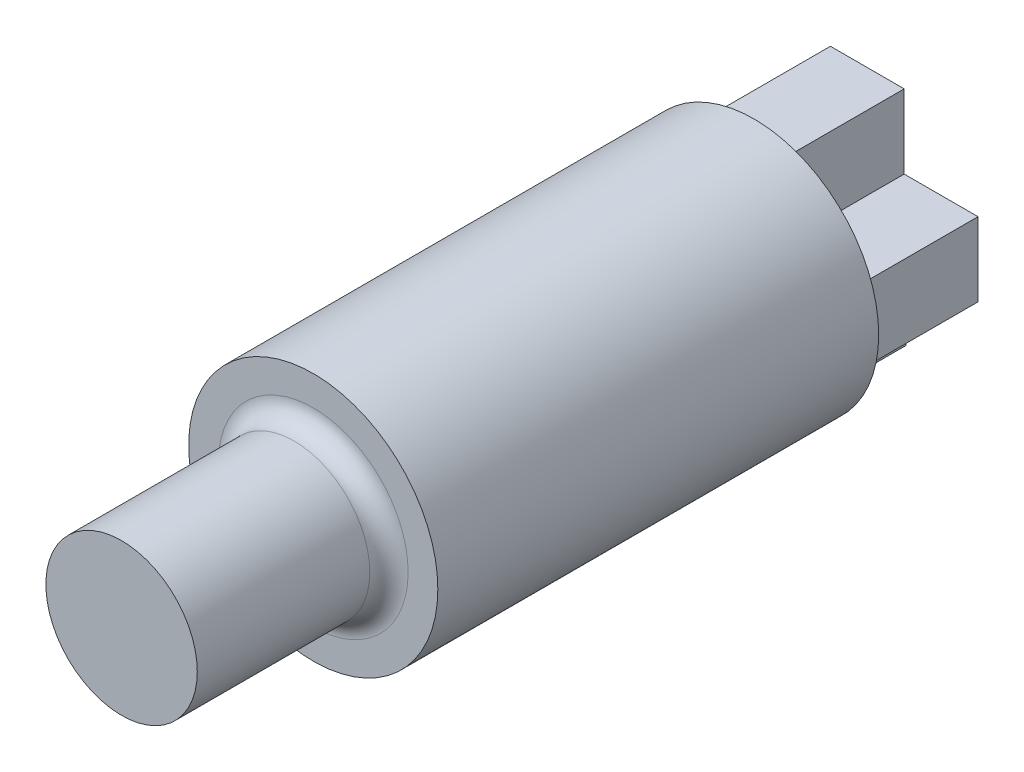
ISO-10303-21;
HEADER;
FILE_DESCRIPTION(('STEP AP214'),'2;1');
FILE_NAME('part.step','',(''),(''),'','','');
FILE_SCHEMA(('AUTOMOTIVE_DESIGN { 1 0 10303 214 1 1 1 1 }'));
ENDSEC;
DATA;
#1=APPLICATION_CONTEXT('core data for automotive mechanical design processes');
#2=APPLICATION_PROTOCOL_DEFINITION('international standard','automotive_design',2000,#1);
#3=PRODUCT_CONTEXT('',#1,'mechanical');
#4=PRODUCT('Part','Part','',(#3));
#5=PRODUCT_RELATED_PRODUCT_CATEGORY('part','',(#4));
#6=PRODUCT_DEFINITION_FORMATION('','',#4);
#7=PRODUCT_DEFINITION_CONTEXT('part definition',#1,'design');
#8=PRODUCT_DEFINITION('design','',#6,#7);
#9=PRODUCT_DEFINITION_SHAPE('','',#8);
#10=(LENGTH_UNIT() NAMED_UNIT(*) SI_UNIT(.MILLI.,.METRE.));
#11=(NAMED_UNIT(*) PLANE_ANGLE_UNIT() SI_UNIT($,.RADIAN.));
#12=(NAMED_UNIT(*) SI_UNIT($,.STERADIAN.) SOLID_ANGLE_UNIT());
#13=UNCERTAINTY_MEASURE_WITH_UNIT(LENGTH_MEASURE(1.E-05),#10,'distance_accuracy_value','');
#14=(GEOMETRIC_REPRESENTATION_CONTEXT(3) GLOBAL_UNCERTAINTY_ASSIGNED_CONTEXT((#13)) GLOBAL_UNIT_ASSIGNED_CONTEXT((#10,
#11,#12)) REPRESENTATION_CONTEXT('',''));
#15=CARTESIAN_POINT('',(0.,0.,0.));
#16=DIRECTION('',(0.,0.,1.));
#17=DIRECTION('',(1.,0.,0.));
#18=AXIS2_PLACEMENT_3D('',#15,#16,#17);
#19=CARTESIAN_POINT('',(0.,0.,0.));
#20=DIRECTION('',(0.,0.,1.));
#21=DIRECTION('',(1.,0.,0.));
#22=AXIS2_PLACEMENT_3D('',#19,#20,#21);
#23=PLANE('',#22);
#24=CARTESIAN_POINT('',(0.,0.,0.));
#25=DIRECTION('',(0.,0.,1.));
#26=DIRECTION('',(1.,0.,0.));
#27=AXIS2_PLACEMENT_3D('',#24,#25,#26);
#28=CIRCLE('',#27,6.5);
#29=CARTESIAN_POINT('',(6.5,0.,0.));
#30=VERTEX_POINT('',#29);
#31=EDGE_CURVE('E163',#30,#30,#28,.T.);
#32=ORIENTED_EDGE('',*,*,#31,.F.);
#33=EDGE_LOOP('',(#32));
#34=FACE_BOUND('',#33,.T.);
#35=DIRECTION('',(0.,-1.,0.));
#36=VECTOR('',#35,1.);
#37=CARTESIAN_POINT('',(1.8306957755296,1.925,0.));
#38=LINE('',#37,#36);
#39=CARTESIAN_POINT('',(1.8306957755296,5.775,0.));
#40=VERTEX_POINT('',#39);
#41=CARTESIAN_POINT('',(1.8306957755296,1.925,0.));
#42=VERTEX_POINT('',#41);
#43=EDGE_CURVE('E61',#40,#42,#38,.T.);
#44=ORIENTED_EDGE('',*,*,#43,.F.);
#45=DIRECTION('',(1.,0.,0.));
#46=VECTOR('',#45,1.);
#47=CARTESIAN_POINT('',(1.8306957755296,5.775,0.));
#48=LINE('',#47,#46);
#49=CARTESIAN_POINT('',(-2.0193042244704,5.775,0.));
#50=VERTEX_POINT('',#49);
#51=EDGE_CURVE('E65',#50,#40,#48,.T.);
#52=ORIENTED_EDGE('',*,*,#51,.F.);
#53=DIRECTION('',(0.,1.,0.));
#54=VECTOR('',#53,1.);
#55=CARTESIAN_POINT('',(-2.0193042244704,5.775,0.));
#56=LINE('',#55,#54);
#57=CARTESIAN_POINT('',(-2.0193042244704,1.925,0.));
#58=VERTEX_POINT('',#57);
#59=EDGE_CURVE('E367',#58,#50,#56,.T.);
#60=ORIENTED_EDGE('',*,*,#59,.F.);
#61=DIRECTION('',(1.,0.,0.));
#62=VECTOR('',#61,1.);
#63=CARTESIAN_POINT('',(-2.0193042244704,1.925,0.));
#64=LINE('',#63,#62);
#65=CARTESIAN_POINT('',(-5.775,1.925,0.));
#66=VERTEX_POINT('',#65);
#67=EDGE_CURVE('E444',#66,#58,#64,.T.);
#68=ORIENTED_EDGE('',*,*,#67,.F.);
#69=DIRECTION('',(0.,1.,0.));
#70=VECTOR('',#69,1.);
#71=CARTESIAN_POINT('',(-5.775,1.925,0.));
#72=LINE('',#71,#70);
#73=CARTESIAN_POINT('',(-5.775,-1.925,0.));
#74=VERTEX_POINT('',#73);
#75=EDGE_CURVE('E440',#74,#66,#72,.T.);
#76=ORIENTED_EDGE('',*,*,#75,.F.);
#77=DIRECTION('',(-1.,0.,0.));
#78=VECTOR('',#77,1.);
#79=CARTESIAN_POINT('',(-5.775,-1.925,0.));
#80=LINE('',#79,#78);
#81=CARTESIAN_POINT('',(-1.925,-1.925,0.));
#82=VERTEX_POINT('',#81);
#83=EDGE_CURVE('E436',#82,#74,#80,.T.);
#84=ORIENTED_EDGE('',*,*,#83,.F.);
#85=DIRECTION('',(0.,1.,0.));
#86=VECTOR('',#85,1.);
#87=CARTESIAN_POINT('',(-1.925,-1.925,0.));
#88=LINE('',#87,#86);
#89=CARTESIAN_POINT('',(-1.925,-5.775,0.));
#90=VERTEX_POINT('',#89);
#91=EDGE_CURVE('E432',#90,#82,#88,.T.);
#92=ORIENTED_EDGE('',*,*,#91,.F.);
#93=DIRECTION('',(-1.,0.,0.));
#94=VECTOR('',#93,1.);
#95=CARTESIAN_POINT('',(-1.925,-5.775,0.));
#96=LINE('',#95,#94);
#97=CARTESIAN_POINT('',(1.925,-5.775,0.));
#98=VERTEX_POINT('',#97);
#99=EDGE_CURVE('E428',#98,#90,#96,.T.);
#100=ORIENTED_EDGE('',*,*,#99,.F.);
#101=DIRECTION('',(0.,-1.,0.));
#102=VECTOR('',#101,1.);
#103=CARTESIAN_POINT('',(1.925,-5.775,0.));
#104=LINE('',#103,#102);
#105=CARTESIAN_POINT('',(1.925,-1.925,0.));
#106=VERTEX_POINT('',#105);
#107=EDGE_CURVE('E420',#106,#98,#104,.T.);
#108=ORIENTED_EDGE('',*,*,#107,.F.);
#109=DIRECTION('',(-1.,0.,0.));
#110=VECTOR('',#109,1.);
#111=CARTESIAN_POINT('',(1.925,-1.925,0.));
#112=LINE('',#111,#110);
#113=CARTESIAN_POINT('',(5.6806957755296,-1.925,0.));
#114=VERTEX_POINT('',#113);
#115=EDGE_CURVE('E411',#114,#106,#112,.T.);
#116=ORIENTED_EDGE('',*,*,#115,.F.);
#117=DIRECTION('',(0.,-1.,0.));
#118=VECTOR('',#117,1.);
#119=CARTESIAN_POINT('',(5.6806957755296,-1.925,0.));
#120=LINE('',#119,#118);
#121=CARTESIAN_POINT('',(5.6806957755296,1.925,0.));
#122=VERTEX_POINT('',#121);
#123=EDGE_CURVE('E414',#122,#114,#120,.T.);
#124=ORIENTED_EDGE('',*,*,#123,.F.);
#125=DIRECTION('',(1.,0.,0.));
#126=VECTOR('',#125,1.);
#127=CARTESIAN_POINT('',(5.6806957755296,1.925,0.));
#128=LINE('',#127,#126);
#129=EDGE_CURVE('E416',#42,#122,#128,.T.);
#130=ORIENTED_EDGE('',*,*,#129,.F.);
#131=EDGE_LOOP('',(#44,#52,#60,#68,#76,#84,#92,#100,#108,#116,#124,#130));
#132=FACE_BOUND('',#131,.T.);
#133=ADVANCED_FACE('F45',(#34,#132),#23,.F.);
#134=CARTESIAN_POINT('',(0.,0.,23.));
#135=DIRECTION('',(0.,0.,-1.));
#136=DIRECTION('',(-1.,0.,0.));
#137=AXIS2_PLACEMENT_3D('',#134,#135,#136);
#138=CYLINDRICAL_SURFACE('',#137,6.5);
#139=CARTESIAN_POINT('',(0.,0.,23.));
#140=DIRECTION('',(0.,0.,1.));
#141=DIRECTION('',(1.,0.,0.));
#142=AXIS2_PLACEMENT_3D('',#139,#140,#141);
#143=CIRCLE('',#142,6.5);
#144=CARTESIAN_POINT('',(6.5,0.,23.));
#145=VERTEX_POINT('',#144);
#146=EDGE_CURVE('E169',#145,#145,#143,.T.);
#147=ORIENTED_EDGE('',*,*,#146,.F.);
#148=EDGE_LOOP('',(#147));
#149=FACE_BOUND('',#148,.T.);
#150=ORIENTED_EDGE('',*,*,#31,.T.);
#151=EDGE_LOOP('',(#150));
#152=FACE_BOUND('',#151,.T.);
#153=ADVANCED_FACE('F195',(#149,#152),#138,.T.);
#154=CARTESIAN_POINT('',(0.,0.,23.));
#155=DIRECTION('',(0.,0.,1.));
#156=DIRECTION('',(1.,0.,0.));
#157=AXIS2_PLACEMENT_3D('',#154,#155,#156);
#158=PLANE('',#157);
#159=CARTESIAN_POINT('',(0.,0.,23.));
#160=DIRECTION('',(0.,0.,1.));
#161=DIRECTION('',(1.,0.,0.));
#162=AXIS2_PLACEMENT_3D('',#159,#160,#161);
#163=CIRCLE('',#162,4.95);
#164=CARTESIAN_POINT('',(4.95,0.,23.));
#165=VERTEX_POINT('',#164);
#166=EDGE_CURVE('E11',#165,#165,#163,.F.);
#167=ORIENTED_EDGE('',*,*,#166,.T.);
#168=EDGE_LOOP('',(#167));
#169=FACE_BOUND('',#168,.T.);
#170=ORIENTED_EDGE('',*,*,#146,.T.);
#171=EDGE_LOOP('',(#170));
#172=FACE_BOUND('',#171,.T.);
#173=ADVANCED_FACE('F201',(#169,#172),#158,.T.);
#174=CARTESIAN_POINT('',(0.,0.,33.));
#175=DIRECTION('',(0.,0.,-1.));
#176=DIRECTION('',(-1.,0.,0.));
#177=AXIS2_PLACEMENT_3D('',#174,#175,#176);
#178=CYLINDRICAL_SURFACE('',#177,3.95);
#179=CARTESIAN_POINT('',(0.,0.,24.));
#180=DIRECTION('',(0.,0.,1.));
#181=DIRECTION('',(1.,0.,0.));
#182=AXIS2_PLACEMENT_3D('',#179,#180,#181);
#183=CIRCLE('',#182,3.95);
#184=CARTESIAN_POINT('',(3.95,0.,24.));
#185=VERTEX_POINT('',#184);
#186=EDGE_CURVE('E54',#185,#185,#183,.T.);
#187=ORIENTED_EDGE('',*,*,#186,.T.);
#188=EDGE_LOOP('',(#187));
#189=FACE_BOUND('',#188,.T.);
#190=CARTESIAN_POINT('',(0.,0.,33.));
#191=DIRECTION('',(0.,0.,1.));
#192=DIRECTION('',(1.,0.,0.));
#193=AXIS2_PLACEMENT_3D('',#190,#191,#192);
#194=CIRCLE('',#193,3.95);
#195=CARTESIAN_POINT('',(3.95,0.,33.));
#196=VERTEX_POINT('',#195);
#197=EDGE_CURVE('E158',#196,#196,#194,.T.);
#198=ORIENTED_EDGE('',*,*,#197,.F.);
#199=EDGE_LOOP('',(#198));
#200=FACE_BOUND('',#199,.T.);
#201=ADVANCED_FACE('F179',(#189,#200),#178,.T.);
#202=CARTESIAN_POINT('',(0.,0.,33.));
#203=DIRECTION('',(0.,0.,1.));
#204=DIRECTION('',(1.,0.,0.));
#205=AXIS2_PLACEMENT_3D('',#202,#203,#204);
#206=PLANE('',#205);
#207=ORIENTED_EDGE('',*,*,#197,.T.);
#208=EDGE_LOOP('',(#207));
#209=FACE_BOUND('',#208,.T.);
#210=ADVANCED_FACE('F183',(#209),#206,.T.);
#211=CARTESIAN_POINT('',(0.,0.,24.));
#212=DIRECTION('',(0.,0.,1.));
#213=DIRECTION('',(1.,0.,0.));
#214=AXIS2_PLACEMENT_3D('',#211,#212,#213);
#215=TOROIDAL_SURFACE('',#214,4.95,1.);
#216=ORIENTED_EDGE('',*,*,#166,.F.);
#217=EDGE_LOOP('',(#216));
#218=FACE_BOUND('',#217,.T.);
#219=ORIENTED_EDGE('',*,*,#186,.F.);
#220=EDGE_LOOP('',(#219));
#221=FACE_BOUND('',#220,.T.);
#222=ADVANCED_FACE('F47',(#218,#221),#215,.F.);
#223=CARTESIAN_POINT('',(1.8306957755296,1.925,-6.));
#224=DIRECTION('',(-1.,0.,0.));
#225=DIRECTION('',(0.,0.,1.));
#226=AXIS2_PLACEMENT_3D('',#223,#224,#225);
#227=PLANE('',#226);
#228=ORIENTED_EDGE('',*,*,#43,.T.);
#229=DIRECTION('',(0.,0.,1.));
#230=VECTOR('',#229,1.);
#231=CARTESIAN_POINT('',(1.8306957755296,1.925,-6.));
#232=LINE('',#231,#230);
#233=CARTESIAN_POINT('',(1.8306957755296,1.925,-6.));
#234=VERTEX_POINT('',#233);
#235=EDGE_CURVE('E138',#234,#42,#232,.T.);
#236=ORIENTED_EDGE('',*,*,#235,.F.);
#237=DIRECTION('',(0.,-1.,0.));
#238=VECTOR('',#237,1.);
#239=CARTESIAN_POINT('',(1.8306957755296,1.925,-6.));
#240=LINE('',#239,#238);
#241=CARTESIAN_POINT('',(1.8306957755296,5.775,-6.));
#242=VERTEX_POINT('',#241);
#243=EDGE_CURVE('E145',#242,#234,#240,.T.);
#244=ORIENTED_EDGE('',*,*,#243,.F.);
#245=DIRECTION('',(0.,0.,1.));
#246=VECTOR('',#245,1.);
#247=CARTESIAN_POINT('',(1.8306957755296,5.775,-6.));
#248=LINE('',#247,#246);
#249=EDGE_CURVE('E363',#242,#40,#248,.T.);
#250=ORIENTED_EDGE('',*,*,#249,.T.);
#251=EDGE_LOOP('',(#228,#236,#244,#250));
#252=FACE_BOUND('',#251,.T.);
#253=ADVANCED_FACE('F156',(#252),#227,.F.);
#254=CARTESIAN_POINT('',(5.6806957755296,1.925,-6.));
#255=DIRECTION('',(0.,-1.,0.));
#256=DIRECTION('',(1.,0.,0.));
#257=AXIS2_PLACEMENT_3D('',#254,#255,#256);
#258=PLANE('',#257);
#259=ORIENTED_EDGE('',*,*,#129,.T.);
#260=DIRECTION('',(0.,0.,1.));
#261=VECTOR('',#260,1.);
#262=CARTESIAN_POINT('',(5.6806957755296,1.925,-6.));
#263=LINE('',#262,#261);
#264=CARTESIAN_POINT('',(5.6806957755296,1.925,-6.));
#265=VERTEX_POINT('',#264);
#266=EDGE_CURVE('E140',#265,#122,#263,.T.);
#267=ORIENTED_EDGE('',*,*,#266,.F.);
#268=DIRECTION('',(1.,0.,0.));
#269=VECTOR('',#268,1.);
#270=CARTESIAN_POINT('',(5.6806957755296,1.925,-6.));
#271=LINE('',#270,#269);
#272=EDGE_CURVE('E133',#234,#265,#271,.T.);
#273=ORIENTED_EDGE('',*,*,#272,.F.);
#274=ORIENTED_EDGE('',*,*,#235,.T.);
#275=EDGE_LOOP('',(#259,#267,#273,#274));
#276=FACE_BOUND('',#275,.T.);
#277=ADVANCED_FACE('F136',(#276),#258,.F.);
#278=CARTESIAN_POINT('',(5.6806957755296,-1.925,-6.));
#279=DIRECTION('',(-1.,0.,0.));
#280=DIRECTION('',(0.,0.,1.));
#281=AXIS2_PLACEMENT_3D('',#278,#279,#280);
#282=PLANE('',#281);
#283=ORIENTED_EDGE('',*,*,#123,.T.);
#284=DIRECTION('',(0.,0.,1.));
#285=VECTOR('',#284,1.);
#286=CARTESIAN_POINT('',(5.6806957755296,-1.925,-6.));
#287=LINE('',#286,#285);
#288=CARTESIAN_POINT('',(5.6806957755296,-1.925,-6.));
#289=VERTEX_POINT('',#288);
#290=EDGE_CURVE('E165',#289,#114,#287,.T.);
#291=ORIENTED_EDGE('',*,*,#290,.F.);
#292=DIRECTION('',(0.,-1.,0.));
#293=VECTOR('',#292,1.);
#294=CARTESIAN_POINT('',(5.6806957755296,-1.925,-6.));
#295=LINE('',#294,#293);
#296=EDGE_CURVE('E144',#265,#289,#295,.T.);
#297=ORIENTED_EDGE('',*,*,#296,.F.);
#298=ORIENTED_EDGE('',*,*,#266,.T.);
#299=EDGE_LOOP('',(#283,#291,#297,#298));
#300=FACE_BOUND('',#299,.T.);
#301=ADVANCED_FACE('F211',(#300),#282,.F.);
#302=CARTESIAN_POINT('',(1.925,-1.925,-6.));
#303=DIRECTION('',(0.,1.,0.));
#304=DIRECTION('',(-1.,0.,0.));
#305=AXIS2_PLACEMENT_3D('',#302,#303,#304);
#306=PLANE('',#305);
#307=ORIENTED_EDGE('',*,*,#115,.T.);
#308=DIRECTION('',(0.,0.,1.));
#309=VECTOR('',#308,1.);
#310=CARTESIAN_POINT('',(1.925,-1.925,-6.));
#311=LINE('',#310,#309);
#312=CARTESIAN_POINT('',(1.925,-1.925,-6.));
#313=VERTEX_POINT('',#312);
#314=EDGE_CURVE('E402',#313,#106,#311,.T.);
#315=ORIENTED_EDGE('',*,*,#314,.F.);
#316=DIRECTION('',(-1.,0.,0.));
#317=VECTOR('',#316,1.);
#318=CARTESIAN_POINT('',(1.925,-1.925,-6.));
#319=LINE('',#318,#317);
#320=EDGE_CURVE('E412',#289,#313,#319,.T.);
#321=ORIENTED_EDGE('',*,*,#320,.F.);
#322=ORIENTED_EDGE('',*,*,#290,.T.);
#323=EDGE_LOOP('',(#307,#315,#321,#322));
#324=FACE_BOUND('',#323,.T.);
#325=ADVANCED_FACE('F214',(#324),#306,.F.);
#326=CARTESIAN_POINT('',(1.925,-5.775,-6.));
#327=DIRECTION('',(-1.,0.,0.));
#328=DIRECTION('',(0.,0.,1.));
#329=AXIS2_PLACEMENT_3D('',#326,#327,#328);
#330=PLANE('',#329);
#331=ORIENTED_EDGE('',*,*,#107,.T.);
#332=DIRECTION('',(0.,0.,1.));
#333=VECTOR('',#332,1.);
#334=CARTESIAN_POINT('',(1.925,-5.775,-6.));
#335=LINE('',#334,#333);
#336=CARTESIAN_POINT('',(1.925,-5.775,-6.));
#337=VERTEX_POINT('',#336);
#338=EDGE_CURVE('E398',#337,#98,#335,.T.);
#339=ORIENTED_EDGE('',*,*,#338,.F.);
#340=DIRECTION('',(0.,-1.,0.));
#341=VECTOR('',#340,1.);
#342=CARTESIAN_POINT('',(1.925,-5.775,-6.));
#343=LINE('',#342,#341);
#344=EDGE_CURVE('E466',#313,#337,#343,.T.);
#345=ORIENTED_EDGE('',*,*,#344,.F.);
#346=ORIENTED_EDGE('',*,*,#314,.T.);
#347=EDGE_LOOP('',(#331,#339,#345,#346));
#348=FACE_BOUND('',#347,.T.);
#349=ADVANCED_FACE('F218',(#348),#330,.F.);
#350=CARTESIAN_POINT('',(-1.925,-5.775,-6.));
#351=DIRECTION('',(0.,1.,0.));
#352=DIRECTION('',(-1.,0.,0.));
#353=AXIS2_PLACEMENT_3D('',#350,#351,#352);
#354=PLANE('',#353);
#355=ORIENTED_EDGE('',*,*,#99,.T.);
#356=DIRECTION('',(0.,0.,1.));
#357=VECTOR('',#356,1.);
#358=CARTESIAN_POINT('',(-1.925,-5.775,-6.));
#359=LINE('',#358,#357);
#360=CARTESIAN_POINT('',(-1.925,-5.775,-6.));
#361=VERTEX_POINT('',#360);
#362=EDGE_CURVE('E394',#361,#90,#359,.T.);
#363=ORIENTED_EDGE('',*,*,#362,.F.);
#364=DIRECTION('',(-1.,0.,0.));
#365=VECTOR('',#364,1.);
#366=CARTESIAN_POINT('',(-1.925,-5.775,-6.));
#367=LINE('',#366,#365);
#368=EDGE_CURVE('E464',#337,#361,#367,.T.);
#369=ORIENTED_EDGE('',*,*,#368,.F.);
#370=ORIENTED_EDGE('',*,*,#338,.T.);
#371=EDGE_LOOP('',(#355,#363,#369,#370));
#372=FACE_BOUND('',#371,.T.);
#373=ADVANCED_FACE('F222',(#372),#354,.F.);
#374=CARTESIAN_POINT('',(-1.925,-1.925,-6.));
#375=DIRECTION('',(1.,0.,0.));
#376=DIRECTION('',(0.,1.,0.));
#377=AXIS2_PLACEMENT_3D('',#374,#375,#376);
#378=PLANE('',#377);
#379=ORIENTED_EDGE('',*,*,#91,.T.);
#380=DIRECTION('',(0.,0.,1.));
#381=VECTOR('',#380,1.);
#382=CARTESIAN_POINT('',(-1.925,-1.925,-6.));
#383=LINE('',#382,#381);
#384=CARTESIAN_POINT('',(-1.925,-1.925,-6.));
#385=VERTEX_POINT('',#384);
#386=EDGE_CURVE('E390',#385,#82,#383,.T.);
#387=ORIENTED_EDGE('',*,*,#386,.F.);
#388=DIRECTION('',(0.,1.,0.));
#389=VECTOR('',#388,1.);
#390=CARTESIAN_POINT('',(-1.925,-1.925,-6.));
#391=LINE('',#390,#389);
#392=EDGE_CURVE('E460',#361,#385,#391,.T.);
#393=ORIENTED_EDGE('',*,*,#392,.F.);
#394=ORIENTED_EDGE('',*,*,#362,.T.);
#395=EDGE_LOOP('',(#379,#387,#393,#394));
#396=FACE_BOUND('',#395,.T.);
#397=ADVANCED_FACE('F226',(#396),#378,.F.);
#398=CARTESIAN_POINT('',(-5.775,-1.925,-6.));
#399=DIRECTION('',(0.,1.,0.));
#400=DIRECTION('',(-1.,0.,0.));
#401=AXIS2_PLACEMENT_3D('',#398,#399,#400);
#402=PLANE('',#401);
#403=ORIENTED_EDGE('',*,*,#83,.T.);
#404=DIRECTION('',(0.,0.,1.));
#405=VECTOR('',#404,1.);
#406=CARTESIAN_POINT('',(-5.775,-1.925,-6.));
#407=LINE('',#406,#405);
#408=CARTESIAN_POINT('',(-5.775,-1.925,-6.));
#409=VERTEX_POINT('',#408);
#410=EDGE_CURVE('E386',#409,#74,#407,.T.);
#411=ORIENTED_EDGE('',*,*,#410,.F.);
#412=DIRECTION('',(-1.,0.,0.));
#413=VECTOR('',#412,1.);
#414=CARTESIAN_POINT('',(-5.775,-1.925,-6.));
#415=LINE('',#414,#413);
#416=EDGE_CURVE('E458',#385,#409,#415,.T.);
#417=ORIENTED_EDGE('',*,*,#416,.F.);
#418=ORIENTED_EDGE('',*,*,#386,.T.);
#419=EDGE_LOOP('',(#403,#411,#417,#418));
#420=FACE_BOUND('',#419,.T.);
#421=ADVANCED_FACE('F230',(#420),#402,.F.);
#422=CARTESIAN_POINT('',(-5.775,1.925,-6.));
#423=DIRECTION('',(1.,0.,0.));
#424=DIRECTION('',(0.,0.,-1.));
#425=AXIS2_PLACEMENT_3D('',#422,#423,#424);
#426=PLANE('',#425);
#427=ORIENTED_EDGE('',*,*,#75,.T.);
#428=DIRECTION('',(0.,0.,1.));
#429=VECTOR('',#428,1.);
#430=CARTESIAN_POINT('',(-5.775,1.925,-6.));
#431=LINE('',#430,#429);
#432=CARTESIAN_POINT('',(-5.775,1.925,-6.));
#433=VERTEX_POINT('',#432);
#434=EDGE_CURVE('E382',#433,#66,#431,.T.);
#435=ORIENTED_EDGE('',*,*,#434,.F.);
#436=DIRECTION('',(0.,1.,0.));
#437=VECTOR('',#436,1.);
#438=CARTESIAN_POINT('',(-5.775,1.925,-6.));
#439=LINE('',#438,#437);
#440=EDGE_CURVE('E454',#409,#433,#439,.T.);
#441=ORIENTED_EDGE('',*,*,#440,.F.);
#442=ORIENTED_EDGE('',*,*,#410,.T.);
#443=EDGE_LOOP('',(#427,#435,#441,#442));
#444=FACE_BOUND('',#443,.T.);
#445=ADVANCED_FACE('F234',(#444),#426,.F.);
#446=CARTESIAN_POINT('',(-2.0193042244704,1.925,-6.));
#447=DIRECTION('',(0.,-1.,0.));
#448=DIRECTION('',(0.,0.,-1.));
#449=AXIS2_PLACEMENT_3D('',#446,#447,#448);
#450=PLANE('',#449);
#451=ORIENTED_EDGE('',*,*,#67,.T.);
#452=DIRECTION('',(0.,0.,1.));
#453=VECTOR('',#452,1.);
#454=CARTESIAN_POINT('',(-2.0193042244704,1.925,-6.));
#455=LINE('',#454,#453);
#456=CARTESIAN_POINT('',(-2.0193042244704,1.925,-6.));
#457=VERTEX_POINT('',#456);
#458=EDGE_CURVE('E373',#457,#58,#455,.T.);
#459=ORIENTED_EDGE('',*,*,#458,.F.);
#460=DIRECTION('',(1.,0.,0.));
#461=VECTOR('',#460,1.);
#462=CARTESIAN_POINT('',(-2.0193042244704,1.925,-6.));
#463=LINE('',#462,#461);
#464=EDGE_CURVE('E452',#433,#457,#463,.T.);
#465=ORIENTED_EDGE('',*,*,#464,.F.);
#466=ORIENTED_EDGE('',*,*,#434,.T.);
#467=EDGE_LOOP('',(#451,#459,#465,#466));
#468=FACE_BOUND('',#467,.T.);
#469=ADVANCED_FACE('F238',(#468),#450,.F.);
#470=CARTESIAN_POINT('',(-2.0193042244704,5.775,-6.));
#471=DIRECTION('',(1.,0.,0.));
#472=DIRECTION('',(0.,1.,0.));
#473=AXIS2_PLACEMENT_3D('',#470,#471,#472);
#474=PLANE('',#473);
#475=ORIENTED_EDGE('',*,*,#59,.T.);
#476=DIRECTION('',(0.,0.,1.));
#477=VECTOR('',#476,1.);
#478=CARTESIAN_POINT('',(-2.0193042244704,5.775,-6.));
#479=LINE('',#478,#477);
#480=CARTESIAN_POINT('',(-2.0193042244704,5.775,-6.));
#481=VERTEX_POINT('',#480);
#482=EDGE_CURVE('E365',#481,#50,#479,.T.);
#483=ORIENTED_EDGE('',*,*,#482,.F.);
#484=DIRECTION('',(0.,1.,0.));
#485=VECTOR('',#484,1.);
#486=CARTESIAN_POINT('',(-2.0193042244704,5.775,-6.));
#487=LINE('',#486,#485);
#488=EDGE_CURVE('E375',#457,#481,#487,.T.);
#489=ORIENTED_EDGE('',*,*,#488,.F.);
#490=ORIENTED_EDGE('',*,*,#458,.T.);
#491=EDGE_LOOP('',(#475,#483,#489,#490));
#492=FACE_BOUND('',#491,.T.);
#493=ADVANCED_FACE('F242',(#492),#474,.F.);
#494=CARTESIAN_POINT('',(1.8306957755296,5.775,-6.));
#495=DIRECTION('',(0.,-1.,0.));
#496=DIRECTION('',(0.,0.,-1.));
#497=AXIS2_PLACEMENT_3D('',#494,#495,#496);
#498=PLANE('',#497);
#499=ORIENTED_EDGE('',*,*,#51,.T.);
#500=ORIENTED_EDGE('',*,*,#249,.F.);
#501=DIRECTION('',(1.,0.,0.));
#502=VECTOR('',#501,1.);
#503=CARTESIAN_POINT('',(1.8306957755296,5.775,-6.));
#504=LINE('',#503,#502);
#505=EDGE_CURVE('E150',#481,#242,#504,.T.);
#506=ORIENTED_EDGE('',*,*,#505,.F.);
#507=ORIENTED_EDGE('',*,*,#482,.T.);
#508=EDGE_LOOP('',(#499,#500,#506,#507));
#509=FACE_BOUND('',#508,.T.);
#510=ADVANCED_FACE('F246',(#509),#498,.F.);
#511=CARTESIAN_POINT('',(0.,0.,-6.));
#512=DIRECTION('',(0.,0.,1.));
#513=DIRECTION('',(1.,0.,0.));
#514=AXIS2_PLACEMENT_3D('',#511,#512,#513);
#515=PLANE('',#514);
#516=ORIENTED_EDGE('',*,*,#243,.T.);
#517=ORIENTED_EDGE('',*,*,#272,.T.);
#518=ORIENTED_EDGE('',*,*,#296,.T.);
#519=ORIENTED_EDGE('',*,*,#320,.T.);
#520=ORIENTED_EDGE('',*,*,#344,.T.);
#521=ORIENTED_EDGE('',*,*,#368,.T.);
#522=ORIENTED_EDGE('',*,*,#392,.T.);
#523=ORIENTED_EDGE('',*,*,#416,.T.);
#524=ORIENTED_EDGE('',*,*,#440,.T.);
#525=ORIENTED_EDGE('',*,*,#464,.T.);
#526=ORIENTED_EDGE('',*,*,#488,.T.);
#527=ORIENTED_EDGE('',*,*,#505,.T.);
#528=EDGE_LOOP('',(#516,#517,#518,#519,#520,#521,#522,#523,#524,#525,#526,#527));
#529=FACE_BOUND('',#528,.T.);
#530=ADVANCED_FACE('F148',(#529),#515,.F.);
#531=CLOSED_SHELL('',(#133,#153,#173,#201,#210,#222,#253,#277,#301,#325,#349,#373,#397,#421,
#445,#469,#493,#510,#530));
#532=MANIFOLD_SOLID_BREP('B2',#531);
#533=ADVANCED_BREP_SHAPE_REPRESENTATION('',(#18,#532),#14);
#534=SHAPE_DEFINITION_REPRESENTATION(#9,#533);
ENDSEC;
END-ISO-10303-21;
